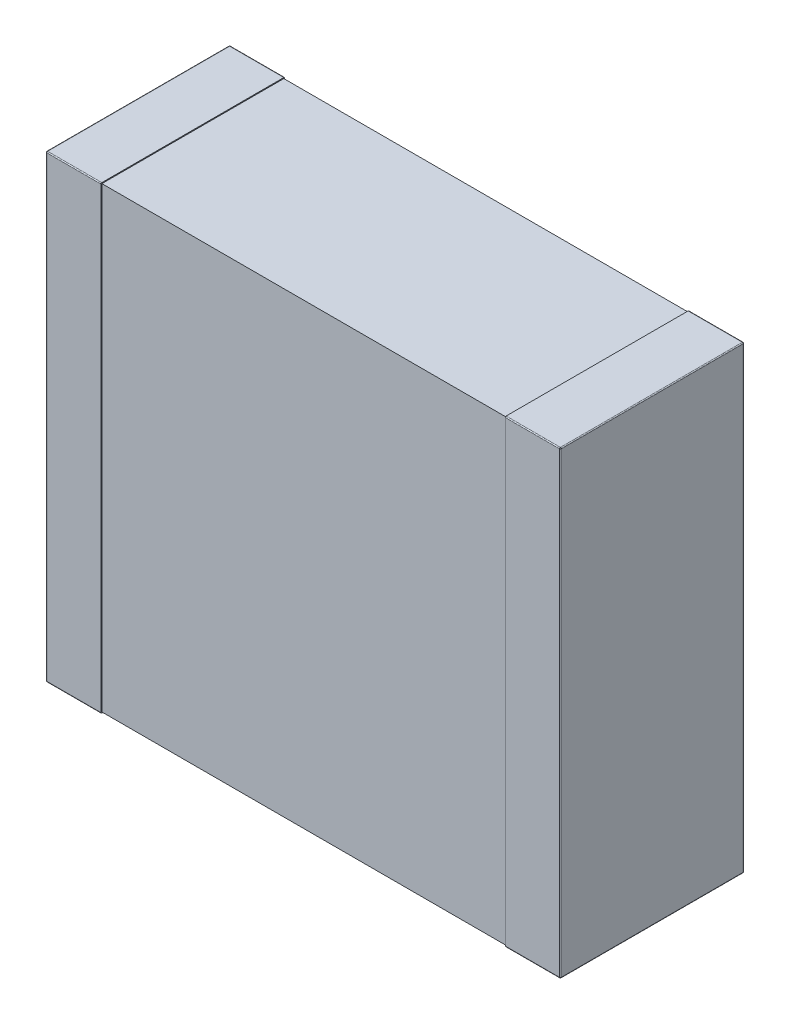
ISO-10303-21;
HEADER;
FILE_DESCRIPTION(('STEP AP214'),'2;1');
FILE_NAME('part.step','',(''),(''),'','','');
FILE_SCHEMA(('AUTOMOTIVE_DESIGN { 1 0 10303 214 1 1 1 1 }'));
ENDSEC;
DATA;
#1=APPLICATION_CONTEXT('core data for automotive mechanical design processes');
#2=APPLICATION_PROTOCOL_DEFINITION('international standard','automotive_design',2000,#1);
#3=PRODUCT_CONTEXT('',#1,'mechanical');
#4=PRODUCT('Part','Part','',(#3));
#5=PRODUCT_RELATED_PRODUCT_CATEGORY('part','',(#4));
#6=PRODUCT_DEFINITION_FORMATION('','',#4);
#7=PRODUCT_DEFINITION_CONTEXT('part definition',#1,'design');
#8=PRODUCT_DEFINITION('design','',#6,#7);
#9=PRODUCT_DEFINITION_SHAPE('','',#8);
#10=(LENGTH_UNIT() NAMED_UNIT(*) SI_UNIT(.MILLI.,.METRE.));
#11=(NAMED_UNIT(*) PLANE_ANGLE_UNIT() SI_UNIT($,.RADIAN.));
#12=(NAMED_UNIT(*) SI_UNIT($,.STERADIAN.) SOLID_ANGLE_UNIT());
#13=UNCERTAINTY_MEASURE_WITH_UNIT(LENGTH_MEASURE(1.E-05),#10,'distance_accuracy_value','');
#14=(GEOMETRIC_REPRESENTATION_CONTEXT(3) GLOBAL_UNCERTAINTY_ASSIGNED_CONTEXT((#13)) GLOBAL_UNIT_ASSIGNED_CONTEXT((#10,
#11,#12)) REPRESENTATION_CONTEXT('',''));
#15=CARTESIAN_POINT('',(0.,0.,0.));
#16=DIRECTION('',(0.,0.,1.));
#17=DIRECTION('',(1.,0.,0.));
#18=AXIS2_PLACEMENT_3D('',#15,#16,#17);
#19=CARTESIAN_POINT('',(-2.8,2.5,2.));
#20=DIRECTION('',(1.,0.,0.));
#21=DIRECTION('',(0.,0.,-1.));
#22=AXIS2_PLACEMENT_3D('',#19,#20,#21);
#23=PLANE('',#22);
#24=DIRECTION('',(0.,0.,-1.));
#25=VECTOR('',#24,1.);
#26=CARTESIAN_POINT('',(-2.8,2.49,2.));
#27=LINE('',#26,#25);
#28=CARTESIAN_POINT('',(-2.8,2.49,1.99));
#29=VERTEX_POINT('',#28);
#30=CARTESIAN_POINT('',(-2.8,2.49,0.01));
#31=VERTEX_POINT('',#30);
#32=EDGE_CURVE('E352',#29,#31,#27,.T.);
#33=ORIENTED_EDGE('',*,*,#32,.T.);
#34=DIRECTION('',(0.,-1.,0.));
#35=VECTOR('',#34,1.);
#36=CARTESIAN_POINT('',(-2.8,2.5,0.01));
#37=LINE('',#36,#35);
#38=CARTESIAN_POINT('',(-2.8,-2.49,0.01));
#39=VERTEX_POINT('',#38);
#40=EDGE_CURVE('E354',#31,#39,#37,.T.);
#41=ORIENTED_EDGE('',*,*,#40,.T.);
#42=DIRECTION('',(0.,0.,-1.));
#43=VECTOR('',#42,1.);
#44=CARTESIAN_POINT('',(-2.8,-2.49,2.));
#45=LINE('',#44,#43);
#46=CARTESIAN_POINT('',(-2.8,-2.49,1.99));
#47=VERTEX_POINT('',#46);
#48=EDGE_CURVE('E350',#39,#47,#45,.F.);
#49=ORIENTED_EDGE('',*,*,#48,.T.);
#50=DIRECTION('',(0.,-1.,0.));
#51=VECTOR('',#50,1.);
#52=CARTESIAN_POINT('',(-2.8,2.5,1.99));
#53=LINE('',#52,#51);
#54=EDGE_CURVE('E348',#47,#29,#53,.F.);
#55=ORIENTED_EDGE('',*,*,#54,.T.);
#56=EDGE_LOOP('',(#33,#41,#49,#55));
#57=FACE_BOUND('',#56,.T.);
#58=ADVANCED_FACE('F37',(#57),#23,.F.);
#59=CARTESIAN_POINT('',(-2.8,-2.5,2.));
#60=DIRECTION('',(0.,1.,0.));
#61=DIRECTION('',(0.,0.,1.));
#62=AXIS2_PLACEMENT_3D('',#59,#60,#61);
#63=PLANE('',#62);
#64=DIRECTION('',(0.,0.,-1.));
#65=VECTOR('',#64,1.);
#66=CARTESIAN_POINT('',(-2.79,-2.5,2.));
#67=LINE('',#66,#65);
#68=CARTESIAN_POINT('',(-2.79,-2.5,1.99));
#69=VERTEX_POINT('',#68);
#70=CARTESIAN_POINT('',(-2.79,-2.5,0.01));
#71=VERTEX_POINT('',#70);
#72=EDGE_CURVE('E380',#69,#71,#67,.T.);
#73=ORIENTED_EDGE('',*,*,#72,.T.);
#74=DIRECTION('',(1.,0.,0.));
#75=VECTOR('',#74,1.);
#76=CARTESIAN_POINT('',(-2.8,-2.5,0.01));
#77=LINE('',#76,#75);
#78=CARTESIAN_POINT('',(-2.2,-2.5,0.01));
#79=VERTEX_POINT('',#78);
#80=EDGE_CURVE('E382',#71,#79,#77,.T.);
#81=ORIENTED_EDGE('',*,*,#80,.T.);
#82=DIRECTION('',(0.,0.,-1.));
#83=VECTOR('',#82,1.);
#84=CARTESIAN_POINT('',(-2.2,-2.5,2.));
#85=LINE('',#84,#83);
#86=CARTESIAN_POINT('',(-2.2,-2.5,1.99));
#87=VERTEX_POINT('',#86);
#88=EDGE_CURVE('E345',#87,#79,#85,.T.);
#89=ORIENTED_EDGE('',*,*,#88,.F.);
#90=DIRECTION('',(1.,0.,0.));
#91=VECTOR('',#90,1.);
#92=CARTESIAN_POINT('',(-2.8,-2.5,1.99));
#93=LINE('',#92,#91);
#94=EDGE_CURVE('E378',#87,#69,#93,.F.);
#95=ORIENTED_EDGE('',*,*,#94,.T.);
#96=EDGE_LOOP('',(#73,#81,#89,#95));
#97=FACE_BOUND('',#96,.T.);
#98=ADVANCED_FACE('F451',(#97),#63,.F.);
#99=CARTESIAN_POINT('',(-2.2,2.5,2.));
#100=DIRECTION('',(-1.,0.,0.));
#101=DIRECTION('',(0.,0.,1.));
#102=AXIS2_PLACEMENT_3D('',#99,#100,#101);
#103=PLANE('',#102);
#104=DIRECTION('',(0.,1.,0.));
#105=VECTOR('',#104,1.);
#106=CARTESIAN_POINT('',(-2.2,2.49,0.01));
#107=LINE('',#106,#105);
#108=CARTESIAN_POINT('',(-2.2,-2.49,0.00999999999999959));
#109=VERTEX_POINT('',#108);
#110=CARTESIAN_POINT('',(-2.2,2.49,0.01));
#111=VERTEX_POINT('',#110);
#112=EDGE_CURVE('E211',#109,#111,#107,.T.);
#113=ORIENTED_EDGE('',*,*,#112,.F.);
#114=DIRECTION('',(0.,0.,-1.));
#115=VECTOR('',#114,1.);
#116=CARTESIAN_POINT('',(-2.2,-2.49,1.99));
#117=LINE('',#116,#115);
#118=CARTESIAN_POINT('',(-2.2,-2.49,1.99));
#119=VERTEX_POINT('',#118);
#120=EDGE_CURVE('E206',#119,#109,#117,.T.);
#121=ORIENTED_EDGE('',*,*,#120,.F.);
#122=DIRECTION('',(0.,-1.,0.));
#123=VECTOR('',#122,1.);
#124=CARTESIAN_POINT('',(-2.2,2.49,1.99));
#125=LINE('',#124,#123);
#126=CARTESIAN_POINT('',(-2.2,2.49,1.99));
#127=VERTEX_POINT('',#126);
#128=EDGE_CURVE('E327',#127,#119,#125,.T.);
#129=ORIENTED_EDGE('',*,*,#128,.F.);
#130=DIRECTION('',(0.,0.,1.));
#131=VECTOR('',#130,1.);
#132=CARTESIAN_POINT('',(-2.2,2.49,1.99));
#133=LINE('',#132,#131);
#134=EDGE_CURVE('E54',#111,#127,#133,.T.);
#135=ORIENTED_EDGE('',*,*,#134,.F.);
#136=EDGE_LOOP('',(#113,#121,#129,#135));
#137=FACE_BOUND('',#136,.T.);
#138=DIRECTION('',(0.,1.,0.));
#139=VECTOR('',#138,1.);
#140=CARTESIAN_POINT('',(-2.2,2.5,0.));
#141=LINE('',#140,#139);
#142=CARTESIAN_POINT('',(-2.2,-2.49,0.));
#143=VERTEX_POINT('',#142);
#144=CARTESIAN_POINT('',(-2.2,2.49,0.));
#145=VERTEX_POINT('',#144);
#146=EDGE_CURVE('E340',#143,#145,#141,.T.);
#147=ORIENTED_EDGE('',*,*,#146,.T.);
#148=CARTESIAN_POINT('',(-2.2,2.49,0.01));
#149=DIRECTION('',(-1.,0.,0.));
#150=DIRECTION('',(0.,0.,1.));
#151=AXIS2_PLACEMENT_3D('',#148,#149,#150);
#152=CIRCLE('',#151,0.01);
#153=CARTESIAN_POINT('',(-2.2,2.5,0.01));
#154=VERTEX_POINT('',#153);
#155=EDGE_CURVE('E376',#145,#154,#152,.F.);
#156=ORIENTED_EDGE('',*,*,#155,.T.);
#157=DIRECTION('',(0.,0.,-1.));
#158=VECTOR('',#157,1.);
#159=CARTESIAN_POINT('',(-2.2,2.5,2.));
#160=LINE('',#159,#158);
#161=CARTESIAN_POINT('',(-2.2,2.5,1.99));
#162=VERTEX_POINT('',#161);
#163=EDGE_CURVE('E339',#162,#154,#160,.T.);
#164=ORIENTED_EDGE('',*,*,#163,.F.);
#165=CARTESIAN_POINT('',(-2.2,2.49,1.99));
#166=DIRECTION('',(-1.,0.,0.));
#167=DIRECTION('',(0.,0.,1.));
#168=AXIS2_PLACEMENT_3D('',#165,#166,#167);
#169=CIRCLE('',#168,0.01);
#170=CARTESIAN_POINT('',(-2.2,2.49,2.));
#171=VERTEX_POINT('',#170);
#172=EDGE_CURVE('E372',#162,#171,#169,.F.);
#173=ORIENTED_EDGE('',*,*,#172,.T.);
#174=DIRECTION('',(0.,1.,0.));
#175=VECTOR('',#174,1.);
#176=CARTESIAN_POINT('',(-2.2,2.5,2.));
#177=LINE('',#176,#175);
#178=CARTESIAN_POINT('',(-2.2,-2.49,2.));
#179=VERTEX_POINT('',#178);
#180=EDGE_CURVE('E337',#179,#171,#177,.T.);
#181=ORIENTED_EDGE('',*,*,#180,.F.);
#182=CARTESIAN_POINT('',(-2.2,-2.49,1.99));
#183=DIRECTION('',(-1.,0.,0.));
#184=DIRECTION('',(0.,0.,1.));
#185=AXIS2_PLACEMENT_3D('',#182,#183,#184);
#186=CIRCLE('',#185,0.01);
#187=EDGE_CURVE('E370',#179,#87,#186,.F.);
#188=ORIENTED_EDGE('',*,*,#187,.T.);
#189=ORIENTED_EDGE('',*,*,#88,.T.);
#190=CARTESIAN_POINT('',(-2.2,-2.49,0.01));
#191=DIRECTION('',(-1.,0.,0.));
#192=DIRECTION('',(0.,0.,1.));
#193=AXIS2_PLACEMENT_3D('',#190,#191,#192);
#194=CIRCLE('',#193,0.01);
#195=EDGE_CURVE('E374',#79,#143,#194,.F.);
#196=ORIENTED_EDGE('',*,*,#195,.T.);
#197=EDGE_LOOP('',(#147,#156,#164,#173,#181,#188,#189,#196));
#198=FACE_BOUND('',#197,.T.);
#199=ADVANCED_FACE('F448',(#137,#198),#103,.F.);
#200=CARTESIAN_POINT('',(-2.8,2.5,2.));
#201=DIRECTION('',(0.,-1.,0.));
#202=DIRECTION('',(0.,0.,-1.));
#203=AXIS2_PLACEMENT_3D('',#200,#201,#202);
#204=PLANE('',#203);
#205=ORIENTED_EDGE('',*,*,#163,.T.);
#206=DIRECTION('',(-1.,0.,0.));
#207=VECTOR('',#206,1.);
#208=CARTESIAN_POINT('',(-2.8,2.5,0.01));
#209=LINE('',#208,#207);
#210=CARTESIAN_POINT('',(-2.79,2.5,0.01));
#211=VERTEX_POINT('',#210);
#212=EDGE_CURVE('E368',#154,#211,#209,.T.);
#213=ORIENTED_EDGE('',*,*,#212,.T.);
#214=DIRECTION('',(0.,0.,-1.));
#215=VECTOR('',#214,1.);
#216=CARTESIAN_POINT('',(-2.79,2.5,2.));
#217=LINE('',#216,#215);
#218=CARTESIAN_POINT('',(-2.79,2.5,1.99));
#219=VERTEX_POINT('',#218);
#220=EDGE_CURVE('E366',#211,#219,#217,.F.);
#221=ORIENTED_EDGE('',*,*,#220,.T.);
#222=DIRECTION('',(-1.,0.,0.));
#223=VECTOR('',#222,1.);
#224=CARTESIAN_POINT('',(-2.2,2.5,1.99));
#225=LINE('',#224,#223);
#226=EDGE_CURVE('E364',#219,#162,#225,.F.);
#227=ORIENTED_EDGE('',*,*,#226,.T.);
#228=EDGE_LOOP('',(#205,#213,#221,#227));
#229=FACE_BOUND('',#228,.T.);
#230=ADVANCED_FACE('F477',(#229),#204,.F.);
#231=CARTESIAN_POINT('',(-2.8,-2.5,2.));
#232=DIRECTION('',(0.,0.,1.));
#233=DIRECTION('',(1.,0.,0.));
#234=AXIS2_PLACEMENT_3D('',#231,#232,#233);
#235=PLANE('',#234);
#236=ORIENTED_EDGE('',*,*,#180,.T.);
#237=DIRECTION('',(-1.,0.,0.));
#238=VECTOR('',#237,1.);
#239=CARTESIAN_POINT('',(-2.8,2.49,2.));
#240=LINE('',#239,#238);
#241=CARTESIAN_POINT('',(-2.79,2.49,2.));
#242=VERTEX_POINT('',#241);
#243=EDGE_CURVE('E11',#171,#242,#240,.T.);
#244=ORIENTED_EDGE('',*,*,#243,.T.);
#245=DIRECTION('',(0.,-1.,0.));
#246=VECTOR('',#245,1.);
#247=CARTESIAN_POINT('',(-2.79,-2.5,2.));
#248=LINE('',#247,#246);
#249=CARTESIAN_POINT('',(-2.79,-2.49,2.));
#250=VERTEX_POINT('',#249);
#251=EDGE_CURVE('E46',#242,#250,#248,.T.);
#252=ORIENTED_EDGE('',*,*,#251,.T.);
#253=DIRECTION('',(1.,0.,0.));
#254=VECTOR('',#253,1.);
#255=CARTESIAN_POINT('',(-2.2,-2.49,2.));
#256=LINE('',#255,#254);
#257=EDGE_CURVE('E384',#250,#179,#256,.T.);
#258=ORIENTED_EDGE('',*,*,#257,.T.);
#259=EDGE_LOOP('',(#236,#244,#252,#258));
#260=FACE_BOUND('',#259,.T.);
#261=ADVANCED_FACE('F438',(#260),#235,.T.);
#262=CARTESIAN_POINT('',(-2.8,-2.5,0.));
#263=DIRECTION('',(0.,0.,1.));
#264=DIRECTION('',(1.,0.,0.));
#265=AXIS2_PLACEMENT_3D('',#262,#263,#264);
#266=PLANE('',#265);
#267=DIRECTION('',(0.,-1.,0.));
#268=VECTOR('',#267,1.);
#269=CARTESIAN_POINT('',(-2.79,-2.5,0.));
#270=LINE('',#269,#268);
#271=CARTESIAN_POINT('',(-2.79,-2.49,0.));
#272=VERTEX_POINT('',#271);
#273=CARTESIAN_POINT('',(-2.79,2.49,0.));
#274=VERTEX_POINT('',#273);
#275=EDGE_CURVE('E359',#272,#274,#270,.F.);
#276=ORIENTED_EDGE('',*,*,#275,.T.);
#277=DIRECTION('',(-1.,0.,0.));
#278=VECTOR('',#277,1.);
#279=CARTESIAN_POINT('',(-2.8,2.49,0.));
#280=LINE('',#279,#278);
#281=EDGE_CURVE('E362',#274,#145,#280,.F.);
#282=ORIENTED_EDGE('',*,*,#281,.T.);
#283=ORIENTED_EDGE('',*,*,#146,.F.);
#284=DIRECTION('',(1.,0.,0.));
#285=VECTOR('',#284,1.);
#286=CARTESIAN_POINT('',(-2.8,-2.49,0.));
#287=LINE('',#286,#285);
#288=EDGE_CURVE('E357',#143,#272,#287,.F.);
#289=ORIENTED_EDGE('',*,*,#288,.T.);
#290=EDGE_LOOP('',(#276,#282,#283,#289));
#291=FACE_BOUND('',#290,.T.);
#292=ADVANCED_FACE('F468',(#291),#266,.F.);
#293=CARTESIAN_POINT('',(-2.8,2.49,1.99));
#294=DIRECTION('',(1.,0.,0.));
#295=DIRECTION('',(0.,0.,-1.));
#296=AXIS2_PLACEMENT_3D('',#293,#294,#295);
#297=CYLINDRICAL_SURFACE('',#296,0.01);
#298=ORIENTED_EDGE('',*,*,#172,.F.);
#299=ORIENTED_EDGE('',*,*,#226,.F.);
#300=CARTESIAN_POINT('',(-2.79,2.49,1.99));
#301=DIRECTION('',(-1.,0.,0.));
#302=DIRECTION('',(0.,0.,1.));
#303=AXIS2_PLACEMENT_3D('',#300,#301,#302);
#304=CIRCLE('',#303,0.01);
#305=EDGE_CURVE('E41',#242,#219,#304,.T.);
#306=ORIENTED_EDGE('',*,*,#305,.F.);
#307=ORIENTED_EDGE('',*,*,#243,.F.);
#308=EDGE_LOOP('',(#298,#299,#306,#307));
#309=FACE_BOUND('',#308,.T.);
#310=ADVANCED_FACE('F39',(#309),#297,.T.);
#311=CARTESIAN_POINT('',(-2.79,-2.5,1.99));
#312=DIRECTION('',(0.,1.,0.));
#313=DIRECTION('',(0.,0.,1.));
#314=AXIS2_PLACEMENT_3D('',#311,#312,#313);
#315=CYLINDRICAL_SURFACE('',#314,0.01);
#316=CARTESIAN_POINT('',(-2.79,-2.49,1.99));
#317=DIRECTION('',(0.,-1.,0.));
#318=DIRECTION('',(0.,0.,-1.));
#319=AXIS2_PLACEMENT_3D('',#316,#317,#318);
#320=CIRCLE('',#319,0.01);
#321=EDGE_CURVE('E411',#250,#47,#320,.T.);
#322=ORIENTED_EDGE('',*,*,#321,.F.);
#323=ORIENTED_EDGE('',*,*,#251,.F.);
#324=CARTESIAN_POINT('',(-2.79,2.49,1.99));
#325=DIRECTION('',(0.,1.,0.));
#326=DIRECTION('',(0.,0.,1.));
#327=AXIS2_PLACEMENT_3D('',#324,#325,#326);
#328=CIRCLE('',#327,0.01);
#329=EDGE_CURVE('E413',#29,#242,#328,.T.);
#330=ORIENTED_EDGE('',*,*,#329,.F.);
#331=ORIENTED_EDGE('',*,*,#54,.F.);
#332=EDGE_LOOP('',(#322,#323,#330,#331));
#333=FACE_BOUND('',#332,.T.);
#334=ADVANCED_FACE('F436',(#333),#315,.T.);
#335=CARTESIAN_POINT('',(-2.8,-2.49,1.99));
#336=DIRECTION('',(-1.,0.,0.));
#337=DIRECTION('',(0.,0.,1.));
#338=AXIS2_PLACEMENT_3D('',#335,#336,#337);
#339=CYLINDRICAL_SURFACE('',#338,0.01);
#340=ORIENTED_EDGE('',*,*,#187,.F.);
#341=ORIENTED_EDGE('',*,*,#257,.F.);
#342=CARTESIAN_POINT('',(-2.79,-2.49,1.99));
#343=DIRECTION('',(-1.,0.,0.));
#344=DIRECTION('',(0.,0.,1.));
#345=AXIS2_PLACEMENT_3D('',#342,#343,#344);
#346=CIRCLE('',#345,0.01);
#347=EDGE_CURVE('E408',#69,#250,#346,.T.);
#348=ORIENTED_EDGE('',*,*,#347,.F.);
#349=ORIENTED_EDGE('',*,*,#94,.F.);
#350=EDGE_LOOP('',(#340,#341,#348,#349));
#351=FACE_BOUND('',#350,.T.);
#352=ADVANCED_FACE('F443',(#351),#339,.T.);
#353=CARTESIAN_POINT('',(-2.79,2.49,1.99));
#354=DIRECTION('',(0.,0.,1.));
#355=DIRECTION('',(1.,0.,0.));
#356=AXIS2_PLACEMENT_3D('',#353,#354,#355);
#357=SPHERICAL_SURFACE('',#356,0.01);
#358=ORIENTED_EDGE('',*,*,#329,.T.);
#359=ORIENTED_EDGE('',*,*,#305,.T.);
#360=CARTESIAN_POINT('',(-2.79,2.49,1.99));
#361=DIRECTION('',(0.,0.,1.));
#362=DIRECTION('',(1.,0.,0.));
#363=AXIS2_PLACEMENT_3D('',#360,#361,#362);
#364=CIRCLE('',#363,0.01);
#365=EDGE_CURVE('E405',#29,#219,#364,.F.);
#366=ORIENTED_EDGE('',*,*,#365,.F.);
#367=EDGE_LOOP('',(#358,#359,#366));
#368=FACE_BOUND('',#367,.T.);
#369=ADVANCED_FACE('F420',(#368),#357,.T.);
#370=CARTESIAN_POINT('',(-2.79,-2.49,1.99));
#371=DIRECTION('',(0.,0.,1.));
#372=DIRECTION('',(1.,0.,0.));
#373=AXIS2_PLACEMENT_3D('',#370,#371,#372);
#374=SPHERICAL_SURFACE('',#373,0.01);
#375=ORIENTED_EDGE('',*,*,#347,.T.);
#376=ORIENTED_EDGE('',*,*,#321,.T.);
#377=CARTESIAN_POINT('',(-2.79,-2.49,1.99));
#378=DIRECTION('',(0.,0.,1.));
#379=DIRECTION('',(1.,0.,0.));
#380=AXIS2_PLACEMENT_3D('',#377,#378,#379);
#381=CIRCLE('',#380,0.01);
#382=EDGE_CURVE('E402',#69,#47,#381,.F.);
#383=ORIENTED_EDGE('',*,*,#382,.F.);
#384=EDGE_LOOP('',(#375,#376,#383));
#385=FACE_BOUND('',#384,.T.);
#386=ADVANCED_FACE('F509',(#385),#374,.T.);
#387=CARTESIAN_POINT('',(-2.8,2.49,0.01));
#388=DIRECTION('',(-1.,0.,0.));
#389=DIRECTION('',(0.,0.,1.));
#390=AXIS2_PLACEMENT_3D('',#387,#388,#389);
#391=CYLINDRICAL_SURFACE('',#390,0.01);
#392=ORIENTED_EDGE('',*,*,#155,.F.);
#393=ORIENTED_EDGE('',*,*,#281,.F.);
#394=CARTESIAN_POINT('',(-2.79,2.49,0.01));
#395=DIRECTION('',(-1.,0.,0.));
#396=DIRECTION('',(0.,0.,1.));
#397=AXIS2_PLACEMENT_3D('',#394,#395,#396);
#398=CIRCLE('',#397,0.01);
#399=EDGE_CURVE('E399',#211,#274,#398,.T.);
#400=ORIENTED_EDGE('',*,*,#399,.F.);
#401=ORIENTED_EDGE('',*,*,#212,.F.);
#402=EDGE_LOOP('',(#392,#393,#400,#401));
#403=FACE_BOUND('',#402,.T.);
#404=ADVANCED_FACE('F475',(#403),#391,.T.);
#405=CARTESIAN_POINT('',(-2.79,2.49,2.));
#406=DIRECTION('',(0.,0.,-1.));
#407=DIRECTION('',(-1.,0.,0.));
#408=AXIS2_PLACEMENT_3D('',#405,#406,#407);
#409=CYLINDRICAL_SURFACE('',#408,0.01);
#410=ORIENTED_EDGE('',*,*,#365,.T.);
#411=ORIENTED_EDGE('',*,*,#220,.F.);
#412=CARTESIAN_POINT('',(-2.79,2.49,0.01));
#413=DIRECTION('',(0.,0.,-1.));
#414=DIRECTION('',(-1.,0.,0.));
#415=AXIS2_PLACEMENT_3D('',#412,#413,#414);
#416=CIRCLE('',#415,0.01);
#417=EDGE_CURVE('E396',#31,#211,#416,.T.);
#418=ORIENTED_EDGE('',*,*,#417,.F.);
#419=ORIENTED_EDGE('',*,*,#32,.F.);
#420=EDGE_LOOP('',(#410,#411,#418,#419));
#421=FACE_BOUND('',#420,.T.);
#422=ADVANCED_FACE('F426',(#421),#409,.T.);
#423=CARTESIAN_POINT('',(-2.79,-2.49,2.));
#424=DIRECTION('',(0.,0.,-1.));
#425=DIRECTION('',(-1.,0.,0.));
#426=AXIS2_PLACEMENT_3D('',#423,#424,#425);
#427=CYLINDRICAL_SURFACE('',#426,0.01);
#428=ORIENTED_EDGE('',*,*,#382,.T.);
#429=ORIENTED_EDGE('',*,*,#48,.F.);
#430=CARTESIAN_POINT('',(-2.79,-2.49,0.01));
#431=DIRECTION('',(0.,0.,-1.));
#432=DIRECTION('',(-1.,0.,0.));
#433=AXIS2_PLACEMENT_3D('',#430,#431,#432);
#434=CIRCLE('',#433,0.01);
#435=EDGE_CURVE('E393',#71,#39,#434,.T.);
#436=ORIENTED_EDGE('',*,*,#435,.F.);
#437=ORIENTED_EDGE('',*,*,#72,.F.);
#438=EDGE_LOOP('',(#428,#429,#436,#437));
#439=FACE_BOUND('',#438,.T.);
#440=ADVANCED_FACE('F461',(#439),#427,.T.);
#441=CARTESIAN_POINT('',(-2.8,-2.49,0.01));
#442=DIRECTION('',(1.,0.,0.));
#443=DIRECTION('',(0.,0.,-1.));
#444=AXIS2_PLACEMENT_3D('',#441,#442,#443);
#445=CYLINDRICAL_SURFACE('',#444,0.01);
#446=ORIENTED_EDGE('',*,*,#195,.F.);
#447=ORIENTED_EDGE('',*,*,#80,.F.);
#448=CARTESIAN_POINT('',(-2.79,-2.49,0.01));
#449=DIRECTION('',(-1.,0.,0.));
#450=DIRECTION('',(0.,0.,1.));
#451=AXIS2_PLACEMENT_3D('',#448,#449,#450);
#452=CIRCLE('',#451,0.01);
#453=EDGE_CURVE('E390',#272,#71,#452,.T.);
#454=ORIENTED_EDGE('',*,*,#453,.F.);
#455=ORIENTED_EDGE('',*,*,#288,.F.);
#456=EDGE_LOOP('',(#446,#447,#454,#455));
#457=FACE_BOUND('',#456,.T.);
#458=ADVANCED_FACE('F457',(#457),#445,.T.);
#459=CARTESIAN_POINT('',(-2.79,2.49,0.01));
#460=DIRECTION('',(0.,0.,1.));
#461=DIRECTION('',(1.,0.,0.));
#462=AXIS2_PLACEMENT_3D('',#459,#460,#461);
#463=SPHERICAL_SURFACE('',#462,0.01);
#464=ORIENTED_EDGE('',*,*,#417,.T.);
#465=ORIENTED_EDGE('',*,*,#399,.T.);
#466=CARTESIAN_POINT('',(-2.79,2.49,0.01));
#467=DIRECTION('',(0.,1.,0.));
#468=DIRECTION('',(0.,0.,1.));
#469=AXIS2_PLACEMENT_3D('',#466,#467,#468);
#470=CIRCLE('',#469,0.01);
#471=EDGE_CURVE('E388',#31,#274,#470,.F.);
#472=ORIENTED_EDGE('',*,*,#471,.F.);
#473=EDGE_LOOP('',(#464,#465,#472));
#474=FACE_BOUND('',#473,.T.);
#475=ADVANCED_FACE('F497',(#474),#463,.T.);
#476=CARTESIAN_POINT('',(-2.79,-2.49,0.01));
#477=DIRECTION('',(0.,0.,1.));
#478=DIRECTION('',(1.,0.,0.));
#479=AXIS2_PLACEMENT_3D('',#476,#477,#478);
#480=SPHERICAL_SURFACE('',#479,0.01);
#481=ORIENTED_EDGE('',*,*,#453,.T.);
#482=ORIENTED_EDGE('',*,*,#435,.T.);
#483=CARTESIAN_POINT('',(-2.79,-2.49,0.01));
#484=DIRECTION('',(0.,-1.,0.));
#485=DIRECTION('',(0.,0.,-1.));
#486=AXIS2_PLACEMENT_3D('',#483,#484,#485);
#487=CIRCLE('',#486,0.01);
#488=EDGE_CURVE('E336',#272,#39,#487,.F.);
#489=ORIENTED_EDGE('',*,*,#488,.F.);
#490=EDGE_LOOP('',(#481,#482,#489));
#491=FACE_BOUND('',#490,.T.);
#492=ADVANCED_FACE('F464',(#491),#480,.T.);
#493=CARTESIAN_POINT('',(-2.79,2.5,0.01));
#494=DIRECTION('',(0.,-1.,0.));
#495=DIRECTION('',(0.,0.,-1.));
#496=AXIS2_PLACEMENT_3D('',#493,#494,#495);
#497=CYLINDRICAL_SURFACE('',#496,0.01);
#498=ORIENTED_EDGE('',*,*,#471,.T.);
#499=ORIENTED_EDGE('',*,*,#275,.F.);
#500=ORIENTED_EDGE('',*,*,#488,.T.);
#501=ORIENTED_EDGE('',*,*,#40,.F.);
#502=EDGE_LOOP('',(#498,#499,#500,#501));
#503=FACE_BOUND('',#502,.T.);
#504=ADVANCED_FACE('F466',(#503),#497,.T.);
#505=CARTESIAN_POINT('',(-7.55917904160703,-2.49,1.99));
#506=DIRECTION('',(0.,-1.,0.));
#507=DIRECTION('',(0.,0.,-1.));
#508=AXIS2_PLACEMENT_3D('',#505,#506,#507);
#509=PLANE('',#508);
#510=DIRECTION('',(1.,0.,0.));
#511=VECTOR('',#510,1.);
#512=CARTESIAN_POINT('',(-7.55917904160703,-2.49,1.99));
#513=LINE('',#512,#511);
#514=CARTESIAN_POINT('',(2.2,-2.49,1.99));
#515=VERTEX_POINT('',#514);
#516=EDGE_CURVE('E329',#119,#515,#513,.T.);
#517=ORIENTED_EDGE('',*,*,#516,.F.);
#518=ORIENTED_EDGE('',*,*,#120,.T.);
#519=DIRECTION('',(1.,0.,0.));
#520=VECTOR('',#519,1.);
#521=CARTESIAN_POINT('',(-7.55917904160703,-2.49,0.00999999999999959));
#522=LINE('',#521,#520);
#523=CARTESIAN_POINT('',(2.2,-2.49,0.00999999999999959));
#524=VERTEX_POINT('',#523);
#525=EDGE_CURVE('E199',#109,#524,#522,.T.);
#526=ORIENTED_EDGE('',*,*,#525,.T.);
#527=DIRECTION('',(0.,0.,-1.));
#528=VECTOR('',#527,1.);
#529=CARTESIAN_POINT('',(2.2,-2.49,1.99));
#530=LINE('',#529,#528);
#531=EDGE_CURVE('E203',#515,#524,#530,.T.);
#532=ORIENTED_EDGE('',*,*,#531,.F.);
#533=EDGE_LOOP('',(#517,#518,#526,#532));
#534=FACE_BOUND('',#533,.T.);
#535=ADVANCED_FACE('F202',(#534),#509,.T.);
#536=CARTESIAN_POINT('',(-7.55917904160703,2.49,0.01));
#537=DIRECTION('',(0.,0.,-1.));
#538=DIRECTION('',(0.,1.,0.));
#539=AXIS2_PLACEMENT_3D('',#536,#537,#538);
#540=PLANE('',#539);
#541=ORIENTED_EDGE('',*,*,#525,.F.);
#542=ORIENTED_EDGE('',*,*,#112,.T.);
#543=DIRECTION('',(1.,0.,0.));
#544=VECTOR('',#543,1.);
#545=CARTESIAN_POINT('',(-7.55917904160703,2.49,0.01));
#546=LINE('',#545,#544);
#547=CARTESIAN_POINT('',(2.2,2.49,0.01));
#548=VERTEX_POINT('',#547);
#549=EDGE_CURVE('E223',#111,#548,#546,.T.);
#550=ORIENTED_EDGE('',*,*,#549,.T.);
#551=DIRECTION('',(0.,1.,0.));
#552=VECTOR('',#551,1.);
#553=CARTESIAN_POINT('',(2.2,2.49,0.01));
#554=LINE('',#553,#552);
#555=EDGE_CURVE('E218',#524,#548,#554,.T.);
#556=ORIENTED_EDGE('',*,*,#555,.F.);
#557=EDGE_LOOP('',(#541,#542,#550,#556));
#558=FACE_BOUND('',#557,.T.);
#559=ADVANCED_FACE('F222',(#558),#540,.T.);
#560=CARTESIAN_POINT('',(-7.55917904160703,2.49,1.99));
#561=DIRECTION('',(0.,1.,0.));
#562=DIRECTION('',(0.,0.,1.));
#563=AXIS2_PLACEMENT_3D('',#560,#561,#562);
#564=PLANE('',#563);
#565=ORIENTED_EDGE('',*,*,#549,.F.);
#566=ORIENTED_EDGE('',*,*,#134,.T.);
#567=DIRECTION('',(1.,0.,0.));
#568=VECTOR('',#567,1.);
#569=CARTESIAN_POINT('',(-7.55917904160703,2.49,1.99));
#570=LINE('',#569,#568);
#571=CARTESIAN_POINT('',(2.2,2.49,1.99));
#572=VERTEX_POINT('',#571);
#573=EDGE_CURVE('E330',#127,#572,#570,.T.);
#574=ORIENTED_EDGE('',*,*,#573,.T.);
#575=DIRECTION('',(0.,0.,1.));
#576=VECTOR('',#575,1.);
#577=CARTESIAN_POINT('',(2.2,2.49,1.99));
#578=LINE('',#577,#576);
#579=EDGE_CURVE('E225',#548,#572,#578,.T.);
#580=ORIENTED_EDGE('',*,*,#579,.F.);
#581=EDGE_LOOP('',(#565,#566,#574,#580));
#582=FACE_BOUND('',#581,.T.);
#583=ADVANCED_FACE('F569',(#582),#564,.T.);
#584=CARTESIAN_POINT('',(-7.55917904160703,2.49,1.99));
#585=DIRECTION('',(0.,0.,1.));
#586=DIRECTION('',(0.,-1.,0.));
#587=AXIS2_PLACEMENT_3D('',#584,#585,#586);
#588=PLANE('',#587);
#589=ORIENTED_EDGE('',*,*,#573,.F.);
#590=ORIENTED_EDGE('',*,*,#128,.T.);
#591=ORIENTED_EDGE('',*,*,#516,.T.);
#592=DIRECTION('',(0.,-1.,0.));
#593=VECTOR('',#592,1.);
#594=CARTESIAN_POINT('',(2.2,2.49,1.99));
#595=LINE('',#594,#593);
#596=EDGE_CURVE('E220',#572,#515,#595,.T.);
#597=ORIENTED_EDGE('',*,*,#596,.F.);
#598=EDGE_LOOP('',(#589,#590,#591,#597));
#599=FACE_BOUND('',#598,.T.);
#600=ADVANCED_FACE('F576',(#599),#588,.T.);
#601=CARTESIAN_POINT('',(2.8,2.5,2.));
#602=DIRECTION('',(-1.,0.,0.));
#603=DIRECTION('',(0.,0.,-1.));
#604=AXIS2_PLACEMENT_3D('',#601,#602,#603);
#605=PLANE('',#604);
#606=DIRECTION('',(0.,0.,-1.));
#607=VECTOR('',#606,1.);
#608=CARTESIAN_POINT('',(2.8,2.49,2.));
#609=LINE('',#608,#607);
#610=CARTESIAN_POINT('',(2.8,2.49,1.99));
#611=VERTEX_POINT('',#610);
#612=CARTESIAN_POINT('',(2.8,2.49,0.01));
#613=VERTEX_POINT('',#612);
#614=EDGE_CURVE('E249',#611,#613,#609,.T.);
#615=ORIENTED_EDGE('',*,*,#614,.F.);
#616=DIRECTION('',(0.,-1.,0.));
#617=VECTOR('',#616,1.);
#618=CARTESIAN_POINT('',(2.8,2.5,1.99));
#619=LINE('',#618,#617);
#620=CARTESIAN_POINT('',(2.8,-2.49,1.99));
#621=VERTEX_POINT('',#620);
#622=EDGE_CURVE('E243',#621,#611,#619,.F.);
#623=ORIENTED_EDGE('',*,*,#622,.F.);
#624=DIRECTION('',(0.,0.,-1.));
#625=VECTOR('',#624,1.);
#626=CARTESIAN_POINT('',(2.8,-2.49,2.));
#627=LINE('',#626,#625);
#628=CARTESIAN_POINT('',(2.8,-2.49,0.01));
#629=VERTEX_POINT('',#628);
#630=EDGE_CURVE('E246',#629,#621,#627,.F.);
#631=ORIENTED_EDGE('',*,*,#630,.F.);
#632=DIRECTION('',(0.,-1.,0.));
#633=VECTOR('',#632,1.);
#634=CARTESIAN_POINT('',(2.8,2.5,0.01));
#635=LINE('',#634,#633);
#636=EDGE_CURVE('E252',#613,#629,#635,.T.);
#637=ORIENTED_EDGE('',*,*,#636,.F.);
#638=EDGE_LOOP('',(#615,#623,#631,#637));
#639=FACE_BOUND('',#638,.T.);
#640=ADVANCED_FACE('F583',(#639),#605,.F.);
#641=CARTESIAN_POINT('',(2.8,-2.5,2.));
#642=DIRECTION('',(0.,1.,0.));
#643=DIRECTION('',(0.,0.,1.));
#644=AXIS2_PLACEMENT_3D('',#641,#642,#643);
#645=PLANE('',#644);
#646=DIRECTION('',(0.,0.,-1.));
#647=VECTOR('',#646,1.);
#648=CARTESIAN_POINT('',(2.79,-2.5,2.));
#649=LINE('',#648,#647);
#650=CARTESIAN_POINT('',(2.79,-2.5,1.99));
#651=VERTEX_POINT('',#650);
#652=CARTESIAN_POINT('',(2.79,-2.5,0.01));
#653=VERTEX_POINT('',#652);
#654=EDGE_CURVE('E285',#651,#653,#649,.T.);
#655=ORIENTED_EDGE('',*,*,#654,.F.);
#656=DIRECTION('',(-1.,0.,0.));
#657=VECTOR('',#656,1.);
#658=CARTESIAN_POINT('',(2.8,-2.5,1.99));
#659=LINE('',#658,#657);
#660=CARTESIAN_POINT('',(2.2,-2.5,1.99));
#661=VERTEX_POINT('',#660);
#662=EDGE_CURVE('E282',#661,#651,#659,.F.);
#663=ORIENTED_EDGE('',*,*,#662,.F.);
#664=DIRECTION('',(0.,0.,-1.));
#665=VECTOR('',#664,1.);
#666=CARTESIAN_POINT('',(2.2,-2.5,2.));
#667=LINE('',#666,#665);
#668=CARTESIAN_POINT('',(2.2,-2.5,0.01));
#669=VERTEX_POINT('',#668);
#670=EDGE_CURVE('E240',#661,#669,#667,.T.);
#671=ORIENTED_EDGE('',*,*,#670,.T.);
#672=DIRECTION('',(-1.,0.,0.));
#673=VECTOR('',#672,1.);
#674=CARTESIAN_POINT('',(2.8,-2.5,0.01));
#675=LINE('',#674,#673);
#676=EDGE_CURVE('E288',#653,#669,#675,.T.);
#677=ORIENTED_EDGE('',*,*,#676,.F.);
#678=EDGE_LOOP('',(#655,#663,#671,#677));
#679=FACE_BOUND('',#678,.T.);
#680=ADVANCED_FACE('F592',(#679),#645,.F.);
#681=CARTESIAN_POINT('',(2.2,2.5,2.));
#682=DIRECTION('',(1.,0.,0.));
#683=DIRECTION('',(0.,0.,1.));
#684=AXIS2_PLACEMENT_3D('',#681,#682,#683);
#685=PLANE('',#684);
#686=ORIENTED_EDGE('',*,*,#555,.T.);
#687=ORIENTED_EDGE('',*,*,#579,.T.);
#688=ORIENTED_EDGE('',*,*,#596,.T.);
#689=ORIENTED_EDGE('',*,*,#531,.T.);
#690=EDGE_LOOP('',(#686,#687,#688,#689));
#691=FACE_BOUND('',#690,.T.);
#692=DIRECTION('',(0.,1.,0.));
#693=VECTOR('',#692,1.);
#694=CARTESIAN_POINT('',(2.2,2.5,0.));
#695=LINE('',#694,#693);
#696=CARTESIAN_POINT('',(2.2,-2.49,0.));
#697=VERTEX_POINT('',#696);
#698=CARTESIAN_POINT('',(2.2,2.49,0.));
#699=VERTEX_POINT('',#698);
#700=EDGE_CURVE('E234',#697,#699,#695,.T.);
#701=ORIENTED_EDGE('',*,*,#700,.F.);
#702=CARTESIAN_POINT('',(2.2,-2.49,0.01));
#703=DIRECTION('',(-1.,0.,0.));
#704=DIRECTION('',(0.,0.,1.));
#705=AXIS2_PLACEMENT_3D('',#702,#703,#704);
#706=CIRCLE('',#705,0.01);
#707=EDGE_CURVE('E276',#669,#697,#706,.F.);
#708=ORIENTED_EDGE('',*,*,#707,.F.);
#709=ORIENTED_EDGE('',*,*,#670,.F.);
#710=CARTESIAN_POINT('',(2.2,-2.49,1.99));
#711=DIRECTION('',(-1.,0.,0.));
#712=DIRECTION('',(0.,0.,1.));
#713=AXIS2_PLACEMENT_3D('',#710,#711,#712);
#714=CIRCLE('',#713,0.01);
#715=CARTESIAN_POINT('',(2.2,-2.49,2.));
#716=VERTEX_POINT('',#715);
#717=EDGE_CURVE('E271',#716,#661,#714,.F.);
#718=ORIENTED_EDGE('',*,*,#717,.F.);
#719=DIRECTION('',(0.,1.,0.));
#720=VECTOR('',#719,1.);
#721=CARTESIAN_POINT('',(2.2,2.5,2.));
#722=LINE('',#721,#720);
#723=CARTESIAN_POINT('',(2.2,2.49,2.));
#724=VERTEX_POINT('',#723);
#725=EDGE_CURVE('E230',#716,#724,#722,.T.);
#726=ORIENTED_EDGE('',*,*,#725,.T.);
#727=CARTESIAN_POINT('',(2.2,2.49,1.99));
#728=DIRECTION('',(-1.,0.,0.));
#729=DIRECTION('',(0.,0.,1.));
#730=AXIS2_PLACEMENT_3D('',#727,#728,#729);
#731=CIRCLE('',#730,0.01);
#732=CARTESIAN_POINT('',(2.2,2.5,1.99));
#733=VERTEX_POINT('',#732);
#734=EDGE_CURVE('E273',#733,#724,#731,.F.);
#735=ORIENTED_EDGE('',*,*,#734,.F.);
#736=DIRECTION('',(0.,0.,-1.));
#737=VECTOR('',#736,1.);
#738=CARTESIAN_POINT('',(2.2,2.5,2.));
#739=LINE('',#738,#737);
#740=CARTESIAN_POINT('',(2.2,2.5,0.01));
#741=VERTEX_POINT('',#740);
#742=EDGE_CURVE('E233',#733,#741,#739,.T.);
#743=ORIENTED_EDGE('',*,*,#742,.T.);
#744=CARTESIAN_POINT('',(2.2,2.49,0.01));
#745=DIRECTION('',(-1.,0.,0.));
#746=DIRECTION('',(0.,0.,1.));
#747=AXIS2_PLACEMENT_3D('',#744,#745,#746);
#748=CIRCLE('',#747,0.01);
#749=EDGE_CURVE('E279',#699,#741,#748,.F.);
#750=ORIENTED_EDGE('',*,*,#749,.F.);
#751=EDGE_LOOP('',(#701,#708,#709,#718,#726,#735,#743,#750));
#752=FACE_BOUND('',#751,.T.);
#753=ADVANCED_FACE('F215',(#691,#752),#685,.F.);
#754=CARTESIAN_POINT('',(2.8,2.5,2.));
#755=DIRECTION('',(0.,-1.,0.));
#756=DIRECTION('',(0.,0.,-1.));
#757=AXIS2_PLACEMENT_3D('',#754,#755,#756);
#758=PLANE('',#757);
#759=ORIENTED_EDGE('',*,*,#742,.F.);
#760=DIRECTION('',(1.,0.,0.));
#761=VECTOR('',#760,1.);
#762=CARTESIAN_POINT('',(2.2,2.5,1.99));
#763=LINE('',#762,#761);
#764=CARTESIAN_POINT('',(2.79,2.5,1.99));
#765=VERTEX_POINT('',#764);
#766=EDGE_CURVE('E263',#765,#733,#763,.F.);
#767=ORIENTED_EDGE('',*,*,#766,.F.);
#768=DIRECTION('',(0.,0.,-1.));
#769=VECTOR('',#768,1.);
#770=CARTESIAN_POINT('',(2.79,2.5,2.));
#771=LINE('',#770,#769);
#772=CARTESIAN_POINT('',(2.79,2.5,0.01));
#773=VERTEX_POINT('',#772);
#774=EDGE_CURVE('E265',#773,#765,#771,.F.);
#775=ORIENTED_EDGE('',*,*,#774,.F.);
#776=DIRECTION('',(1.,0.,0.));
#777=VECTOR('',#776,1.);
#778=CARTESIAN_POINT('',(2.8,2.5,0.01));
#779=LINE('',#778,#777);
#780=EDGE_CURVE('E268',#741,#773,#779,.T.);
#781=ORIENTED_EDGE('',*,*,#780,.F.);
#782=EDGE_LOOP('',(#759,#767,#775,#781));
#783=FACE_BOUND('',#782,.T.);
#784=ADVANCED_FACE('F607',(#783),#758,.F.);
#785=CARTESIAN_POINT('',(2.8,-2.5,2.));
#786=DIRECTION('',(0.,0.,1.));
#787=DIRECTION('',(-1.,0.,0.));
#788=AXIS2_PLACEMENT_3D('',#785,#786,#787);
#789=PLANE('',#788);
#790=ORIENTED_EDGE('',*,*,#725,.F.);
#791=DIRECTION('',(-1.,0.,0.));
#792=VECTOR('',#791,1.);
#793=CARTESIAN_POINT('',(2.2,-2.49,2.));
#794=LINE('',#793,#792);
#795=CARTESIAN_POINT('',(2.79,-2.49,2.));
#796=VERTEX_POINT('',#795);
#797=EDGE_CURVE('E291',#796,#716,#794,.T.);
#798=ORIENTED_EDGE('',*,*,#797,.F.);
#799=DIRECTION('',(0.,-1.,0.));
#800=VECTOR('',#799,1.);
#801=CARTESIAN_POINT('',(2.79,-2.5,2.));
#802=LINE('',#801,#800);
#803=CARTESIAN_POINT('',(2.79,2.49,2.));
#804=VERTEX_POINT('',#803);
#805=EDGE_CURVE('E293',#804,#796,#802,.T.);
#806=ORIENTED_EDGE('',*,*,#805,.F.);
#807=DIRECTION('',(1.,0.,0.));
#808=VECTOR('',#807,1.);
#809=CARTESIAN_POINT('',(2.8,2.49,2.));
#810=LINE('',#809,#808);
#811=EDGE_CURVE('E296',#724,#804,#810,.T.);
#812=ORIENTED_EDGE('',*,*,#811,.F.);
#813=EDGE_LOOP('',(#790,#798,#806,#812));
#814=FACE_BOUND('',#813,.T.);
#815=ADVANCED_FACE('F613',(#814),#789,.T.);
#816=CARTESIAN_POINT('',(2.8,-2.5,0.));
#817=DIRECTION('',(0.,0.,1.));
#818=DIRECTION('',(-1.,0.,0.));
#819=AXIS2_PLACEMENT_3D('',#816,#817,#818);
#820=PLANE('',#819);
#821=DIRECTION('',(0.,-1.,0.));
#822=VECTOR('',#821,1.);
#823=CARTESIAN_POINT('',(2.79,-2.5,0.));
#824=LINE('',#823,#822);
#825=CARTESIAN_POINT('',(2.79,-2.49,0.));
#826=VERTEX_POINT('',#825);
#827=CARTESIAN_POINT('',(2.79,2.49,0.));
#828=VERTEX_POINT('',#827);
#829=EDGE_CURVE('E258',#826,#828,#824,.F.);
#830=ORIENTED_EDGE('',*,*,#829,.F.);
#831=DIRECTION('',(-1.,0.,0.));
#832=VECTOR('',#831,1.);
#833=CARTESIAN_POINT('',(2.8,-2.49,0.));
#834=LINE('',#833,#832);
#835=EDGE_CURVE('E255',#697,#826,#834,.F.);
#836=ORIENTED_EDGE('',*,*,#835,.F.);
#837=ORIENTED_EDGE('',*,*,#700,.T.);
#838=DIRECTION('',(1.,0.,0.));
#839=VECTOR('',#838,1.);
#840=CARTESIAN_POINT('',(2.8,2.49,0.));
#841=LINE('',#840,#839);
#842=EDGE_CURVE('E261',#828,#699,#841,.F.);
#843=ORIENTED_EDGE('',*,*,#842,.F.);
#844=EDGE_LOOP('',(#830,#836,#837,#843));
#845=FACE_BOUND('',#844,.T.);
#846=ADVANCED_FACE('F621',(#845),#820,.F.);
#847=CARTESIAN_POINT('',(2.8,2.49,1.99));
#848=DIRECTION('',(-1.,0.,0.));
#849=DIRECTION('',(0.,0.,-1.));
#850=AXIS2_PLACEMENT_3D('',#847,#848,#849);
#851=CYLINDRICAL_SURFACE('',#850,0.01);
#852=ORIENTED_EDGE('',*,*,#734,.T.);
#853=ORIENTED_EDGE('',*,*,#811,.T.);
#854=CARTESIAN_POINT('',(2.79,2.49,1.99));
#855=DIRECTION('',(-1.,0.,0.));
#856=DIRECTION('',(0.,0.,1.));
#857=AXIS2_PLACEMENT_3D('',#854,#855,#856);
#858=CIRCLE('',#857,0.01);
#859=EDGE_CURVE('E237',#804,#765,#858,.T.);
#860=ORIENTED_EDGE('',*,*,#859,.T.);
#861=ORIENTED_EDGE('',*,*,#766,.T.);
#862=EDGE_LOOP('',(#852,#853,#860,#861));
#863=FACE_BOUND('',#862,.T.);
#864=ADVANCED_FACE('F629',(#863),#851,.T.);
#865=CARTESIAN_POINT('',(2.79,-2.5,1.99));
#866=DIRECTION('',(0.,1.,0.));
#867=DIRECTION('',(0.,0.,1.));
#868=AXIS2_PLACEMENT_3D('',#865,#866,#867);
#869=CYLINDRICAL_SURFACE('',#868,0.01);
#870=CARTESIAN_POINT('',(2.79,-2.49,1.99));
#871=DIRECTION('',(0.,1.,0.));
#872=DIRECTION('',(0.,0.,-1.));
#873=AXIS2_PLACEMENT_3D('',#870,#871,#872);
#874=CIRCLE('',#873,0.01);
#875=EDGE_CURVE('E319',#796,#621,#874,.T.);
#876=ORIENTED_EDGE('',*,*,#875,.T.);
#877=ORIENTED_EDGE('',*,*,#622,.T.);
#878=CARTESIAN_POINT('',(2.79,2.49,1.99));
#879=DIRECTION('',(0.,-1.,0.));
#880=DIRECTION('',(0.,0.,1.));
#881=AXIS2_PLACEMENT_3D('',#878,#879,#880);
#882=CIRCLE('',#881,0.01);
#883=EDGE_CURVE('E322',#611,#804,#882,.T.);
#884=ORIENTED_EDGE('',*,*,#883,.T.);
#885=ORIENTED_EDGE('',*,*,#805,.T.);
#886=EDGE_LOOP('',(#876,#877,#884,#885));
#887=FACE_BOUND('',#886,.T.);
#888=ADVANCED_FACE('F638',(#887),#869,.T.);
#889=CARTESIAN_POINT('',(2.8,-2.49,1.99));
#890=DIRECTION('',(1.,0.,0.));
#891=DIRECTION('',(0.,0.,1.));
#892=AXIS2_PLACEMENT_3D('',#889,#890,#891);
#893=CYLINDRICAL_SURFACE('',#892,0.01);
#894=ORIENTED_EDGE('',*,*,#717,.T.);
#895=ORIENTED_EDGE('',*,*,#662,.T.);
#896=CARTESIAN_POINT('',(2.79,-2.49,1.99));
#897=DIRECTION('',(-1.,0.,0.));
#898=DIRECTION('',(0.,0.,1.));
#899=AXIS2_PLACEMENT_3D('',#896,#897,#898);
#900=CIRCLE('',#899,0.01);
#901=EDGE_CURVE('E317',#651,#796,#900,.T.);
#902=ORIENTED_EDGE('',*,*,#901,.T.);
#903=ORIENTED_EDGE('',*,*,#797,.T.);
#904=EDGE_LOOP('',(#894,#895,#902,#903));
#905=FACE_BOUND('',#904,.T.);
#906=ADVANCED_FACE('F646',(#905),#893,.T.);
#907=CARTESIAN_POINT('',(2.79,2.49,1.99));
#908=DIRECTION('',(0.,0.,1.));
#909=DIRECTION('',(-1.,0.,0.));
#910=AXIS2_PLACEMENT_3D('',#907,#908,#909);
#911=SPHERICAL_SURFACE('',#910,0.01);
#912=ORIENTED_EDGE('',*,*,#883,.F.);
#913=CARTESIAN_POINT('',(2.79,2.49,1.99));
#914=DIRECTION('',(0.,0.,-1.));
#915=DIRECTION('',(-1.,0.,0.));
#916=AXIS2_PLACEMENT_3D('',#913,#914,#915);
#917=CIRCLE('',#916,0.01);
#918=EDGE_CURVE('E315',#611,#765,#917,.F.);
#919=ORIENTED_EDGE('',*,*,#918,.T.);
#920=ORIENTED_EDGE('',*,*,#859,.F.);
#921=EDGE_LOOP('',(#912,#919,#920));
#922=FACE_BOUND('',#921,.T.);
#923=ADVANCED_FACE('F654',(#922),#911,.T.);
#924=CARTESIAN_POINT('',(2.79,-2.49,1.99));
#925=DIRECTION('',(0.,0.,1.));
#926=DIRECTION('',(-1.,0.,0.));
#927=AXIS2_PLACEMENT_3D('',#924,#925,#926);
#928=SPHERICAL_SURFACE('',#927,0.01);
#929=ORIENTED_EDGE('',*,*,#901,.F.);
#930=CARTESIAN_POINT('',(2.79,-2.49,1.99));
#931=DIRECTION('',(0.,0.,-1.));
#932=DIRECTION('',(-1.,0.,0.));
#933=AXIS2_PLACEMENT_3D('',#930,#931,#932);
#934=CIRCLE('',#933,0.01);
#935=EDGE_CURVE('E313',#651,#621,#934,.F.);
#936=ORIENTED_EDGE('',*,*,#935,.T.);
#937=ORIENTED_EDGE('',*,*,#875,.F.);
#938=EDGE_LOOP('',(#929,#936,#937));
#939=FACE_BOUND('',#938,.T.);
#940=ADVANCED_FACE('F662',(#939),#928,.T.);
#941=CARTESIAN_POINT('',(2.8,2.49,0.01));
#942=DIRECTION('',(1.,0.,0.));
#943=DIRECTION('',(0.,0.,1.));
#944=AXIS2_PLACEMENT_3D('',#941,#942,#943);
#945=CYLINDRICAL_SURFACE('',#944,0.01);
#946=ORIENTED_EDGE('',*,*,#749,.T.);
#947=ORIENTED_EDGE('',*,*,#780,.T.);
#948=CARTESIAN_POINT('',(2.79,2.49,0.01));
#949=DIRECTION('',(-1.,0.,0.));
#950=DIRECTION('',(0.,0.,1.));
#951=AXIS2_PLACEMENT_3D('',#948,#949,#950);
#952=CIRCLE('',#951,0.01);
#953=EDGE_CURVE('E310',#773,#828,#952,.T.);
#954=ORIENTED_EDGE('',*,*,#953,.T.);
#955=ORIENTED_EDGE('',*,*,#842,.T.);
#956=EDGE_LOOP('',(#946,#947,#954,#955));
#957=FACE_BOUND('',#956,.T.);
#958=ADVANCED_FACE('F671',(#957),#945,.T.);
#959=CARTESIAN_POINT('',(2.79,2.49,2.));
#960=DIRECTION('',(0.,0.,-1.));
#961=DIRECTION('',(1.,0.,0.));
#962=AXIS2_PLACEMENT_3D('',#959,#960,#961);
#963=CYLINDRICAL_SURFACE('',#962,0.01);
#964=ORIENTED_EDGE('',*,*,#918,.F.);
#965=ORIENTED_EDGE('',*,*,#614,.T.);
#966=CARTESIAN_POINT('',(2.79,2.49,0.01));
#967=DIRECTION('',(0.,0.,1.));
#968=DIRECTION('',(1.,0.,0.));
#969=AXIS2_PLACEMENT_3D('',#966,#967,#968);
#970=CIRCLE('',#969,0.01);
#971=EDGE_CURVE('E308',#613,#773,#970,.T.);
#972=ORIENTED_EDGE('',*,*,#971,.T.);
#973=ORIENTED_EDGE('',*,*,#774,.T.);
#974=EDGE_LOOP('',(#964,#965,#972,#973));
#975=FACE_BOUND('',#974,.T.);
#976=ADVANCED_FACE('F680',(#975),#963,.T.);
#977=CARTESIAN_POINT('',(2.79,-2.49,2.));
#978=DIRECTION('',(0.,0.,-1.));
#979=DIRECTION('',(1.,0.,0.));
#980=AXIS2_PLACEMENT_3D('',#977,#978,#979);
#981=CYLINDRICAL_SURFACE('',#980,0.01);
#982=ORIENTED_EDGE('',*,*,#935,.F.);
#983=ORIENTED_EDGE('',*,*,#654,.T.);
#984=CARTESIAN_POINT('',(2.79,-2.49,0.01));
#985=DIRECTION('',(0.,0.,1.));
#986=DIRECTION('',(1.,0.,0.));
#987=AXIS2_PLACEMENT_3D('',#984,#985,#986);
#988=CIRCLE('',#987,0.01);
#989=EDGE_CURVE('E305',#653,#629,#988,.T.);
#990=ORIENTED_EDGE('',*,*,#989,.T.);
#991=ORIENTED_EDGE('',*,*,#630,.T.);
#992=EDGE_LOOP('',(#982,#983,#990,#991));
#993=FACE_BOUND('',#992,.T.);
#994=ADVANCED_FACE('F688',(#993),#981,.T.);
#995=CARTESIAN_POINT('',(2.8,-2.49,0.01));
#996=DIRECTION('',(-1.,0.,0.));
#997=DIRECTION('',(0.,0.,-1.));
#998=AXIS2_PLACEMENT_3D('',#995,#996,#997);
#999=CYLINDRICAL_SURFACE('',#998,0.01);
#1000=ORIENTED_EDGE('',*,*,#707,.T.);
#1001=ORIENTED_EDGE('',*,*,#835,.T.);
#1002=CARTESIAN_POINT('',(2.79,-2.49,0.01));
#1003=DIRECTION('',(-1.,0.,0.));
#1004=DIRECTION('',(0.,0.,1.));
#1005=AXIS2_PLACEMENT_3D('',#1002,#1003,#1004);
#1006=CIRCLE('',#1005,0.01);
#1007=EDGE_CURVE('E303',#826,#653,#1006,.T.);
#1008=ORIENTED_EDGE('',*,*,#1007,.T.);
#1009=ORIENTED_EDGE('',*,*,#676,.T.);
#1010=EDGE_LOOP('',(#1000,#1001,#1008,#1009));
#1011=FACE_BOUND('',#1010,.T.);
#1012=ADVANCED_FACE('F696',(#1011),#999,.T.);
#1013=CARTESIAN_POINT('',(2.79,2.49,0.01));
#1014=DIRECTION('',(0.,0.,1.));
#1015=DIRECTION('',(-1.,0.,0.));
#1016=AXIS2_PLACEMENT_3D('',#1013,#1014,#1015);
#1017=SPHERICAL_SURFACE('',#1016,0.01);
#1018=ORIENTED_EDGE('',*,*,#971,.F.);
#1019=CARTESIAN_POINT('',(2.79,2.49,0.01));
#1020=DIRECTION('',(0.,-1.,0.));
#1021=DIRECTION('',(0.,0.,1.));
#1022=AXIS2_PLACEMENT_3D('',#1019,#1020,#1021);
#1023=CIRCLE('',#1022,0.01);
#1024=EDGE_CURVE('E301',#613,#828,#1023,.F.);
#1025=ORIENTED_EDGE('',*,*,#1024,.T.);
#1026=ORIENTED_EDGE('',*,*,#953,.F.);
#1027=EDGE_LOOP('',(#1018,#1025,#1026));
#1028=FACE_BOUND('',#1027,.T.);
#1029=ADVANCED_FACE('F703',(#1028),#1017,.T.);
#1030=CARTESIAN_POINT('',(2.79,-2.49,0.01));
#1031=DIRECTION('',(0.,0.,1.));
#1032=DIRECTION('',(-1.,0.,0.));
#1033=AXIS2_PLACEMENT_3D('',#1030,#1031,#1032);
#1034=SPHERICAL_SURFACE('',#1033,0.01);
#1035=ORIENTED_EDGE('',*,*,#1007,.F.);
#1036=CARTESIAN_POINT('',(2.79,-2.49,0.01));
#1037=DIRECTION('',(0.,1.,0.));
#1038=DIRECTION('',(0.,0.,-1.));
#1039=AXIS2_PLACEMENT_3D('',#1036,#1037,#1038);
#1040=CIRCLE('',#1039,0.01);
#1041=EDGE_CURVE('E299',#826,#629,#1040,.F.);
#1042=ORIENTED_EDGE('',*,*,#1041,.T.);
#1043=ORIENTED_EDGE('',*,*,#989,.F.);
#1044=EDGE_LOOP('',(#1035,#1042,#1043));
#1045=FACE_BOUND('',#1044,.T.);
#1046=ADVANCED_FACE('F711',(#1045),#1034,.T.);
#1047=CARTESIAN_POINT('',(2.79,2.5,0.01));
#1048=DIRECTION('',(0.,-1.,0.));
#1049=DIRECTION('',(0.,0.,-1.));
#1050=AXIS2_PLACEMENT_3D('',#1047,#1048,#1049);
#1051=CYLINDRICAL_SURFACE('',#1050,0.01);
#1052=ORIENTED_EDGE('',*,*,#1024,.F.);
#1053=ORIENTED_EDGE('',*,*,#636,.T.);
#1054=ORIENTED_EDGE('',*,*,#1041,.F.);
#1055=ORIENTED_EDGE('',*,*,#829,.T.);
#1056=EDGE_LOOP('',(#1052,#1053,#1054,#1055));
#1057=FACE_BOUND('',#1056,.T.);
#1058=ADVANCED_FACE('F718',(#1057),#1051,.T.);
#1059=CLOSED_SHELL('',(#58,#98,#199,#230,#261,#292,#310,#334,#352,#369,#386,#404,#422,#440,#458,
#475,#492,#504,#535,#559,#583,#600,#640,#680,#753,#784,#815,#846,#864,#888,#906,#923,#940,#958,
#976,#994,#1012,#1029,#1046,#1058));
#1060=MANIFOLD_SOLID_BREP('B2',#1059);
#1061=ADVANCED_BREP_SHAPE_REPRESENTATION('',(#18,#1060),#14);
#1062=SHAPE_DEFINITION_REPRESENTATION(#9,#1061);
ENDSEC;
END-ISO-10303-21;
